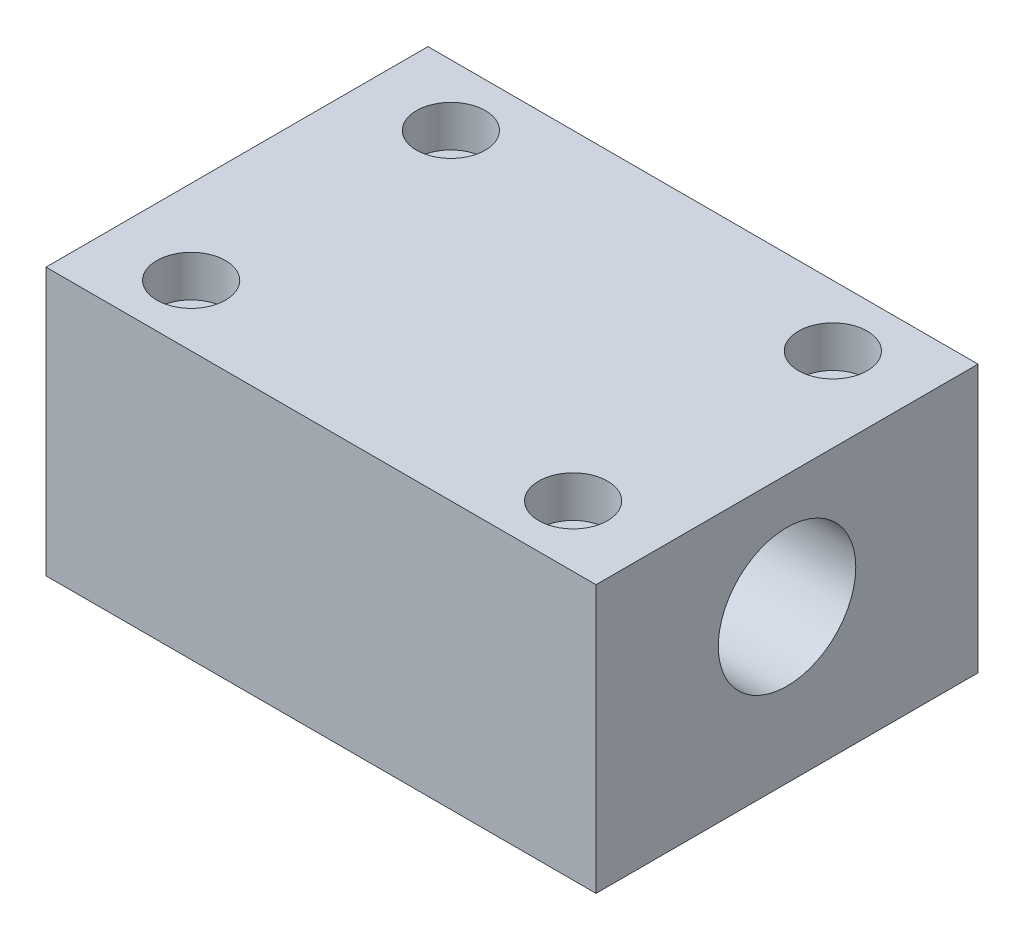
ISO-10303-21;
HEADER;
FILE_DESCRIPTION(('STEP AP214'),'2;1');
FILE_NAME('part.step','',(''),(''),'','','');
FILE_SCHEMA(('AUTOMOTIVE_DESIGN { 1 0 10303 214 1 1 1 1 }'));
ENDSEC;
DATA;
#1=APPLICATION_CONTEXT('core data for automotive mechanical design processes');
#2=APPLICATION_PROTOCOL_DEFINITION('international standard','automotive_design',2000,#1);
#3=PRODUCT_CONTEXT('',#1,'mechanical');
#4=PRODUCT('Part','Part','',(#3));
#5=PRODUCT_RELATED_PRODUCT_CATEGORY('part','',(#4));
#6=PRODUCT_DEFINITION_FORMATION('','',#4);
#7=PRODUCT_DEFINITION_CONTEXT('part definition',#1,'design');
#8=PRODUCT_DEFINITION('design','',#6,#7);
#9=PRODUCT_DEFINITION_SHAPE('','',#8);
#10=(LENGTH_UNIT() NAMED_UNIT(*) SI_UNIT(.MILLI.,.METRE.));
#11=(NAMED_UNIT(*) PLANE_ANGLE_UNIT() SI_UNIT($,.RADIAN.));
#12=(NAMED_UNIT(*) SI_UNIT($,.STERADIAN.) SOLID_ANGLE_UNIT());
#13=UNCERTAINTY_MEASURE_WITH_UNIT(LENGTH_MEASURE(1.E-05),#10,'distance_accuracy_value','');
#14=(GEOMETRIC_REPRESENTATION_CONTEXT(3) GLOBAL_UNCERTAINTY_ASSIGNED_CONTEXT((#13)) GLOBAL_UNIT_ASSIGNED_CONTEXT((#10,
#11,#12)) REPRESENTATION_CONTEXT('',''));
#15=CARTESIAN_POINT('',(0.,0.,0.));
#16=DIRECTION('',(0.,0.,1.));
#17=DIRECTION('',(1.,0.,0.));
#18=AXIS2_PLACEMENT_3D('',#15,#16,#17);
#19=CARTESIAN_POINT('',(11.,-20.,-17.));
#20=DIRECTION('',(0.,1.,0.));
#21=DIRECTION('',(0.,0.,1.));
#22=AXIS2_PLACEMENT_3D('',#19,#20,#21);
#23=CYLINDRICAL_SURFACE('',#22,2.75);
#24=CARTESIAN_POINT('',(11.,-20.,-17.));
#25=DIRECTION('',(0.,1.,0.));
#26=DIRECTION('',(0.,0.,1.));
#27=AXIS2_PLACEMENT_3D('',#24,#25,#26);
#28=CIRCLE('',#27,2.75);
#29=CARTESIAN_POINT('',(11.,-20.,-14.25));
#30=VERTEX_POINT('',#29);
#31=EDGE_CURVE('E142',#30,#30,#28,.T.);
#32=ORIENTED_EDGE('',*,*,#31,.F.);
#33=EDGE_LOOP('',(#32));
#34=FACE_BOUND('',#33,.T.);
#35=CARTESIAN_POINT('',(11.,9.6,-17.));
#36=DIRECTION('',(0.,1.,0.));
#37=DIRECTION('',(0.,0.,1.));
#38=AXIS2_PLACEMENT_3D('',#35,#36,#37);
#39=CIRCLE('',#38,2.75);
#40=CARTESIAN_POINT('',(11.,9.6,-14.25));
#41=VERTEX_POINT('',#40);
#42=EDGE_CURVE('E43',#41,#41,#39,.F.);
#43=ORIENTED_EDGE('',*,*,#42,.F.);
#44=EDGE_LOOP('',(#43));
#45=FACE_BOUND('',#44,.T.);
#46=ADVANCED_FACE('F39',(#34,#45),#23,.F.);
#47=CARTESIAN_POINT('',(61.,-20.,17.));
#48=DIRECTION('',(0.,1.,0.));
#49=DIRECTION('',(0.,0.,1.));
#50=AXIS2_PLACEMENT_3D('',#47,#48,#49);
#51=CYLINDRICAL_SURFACE('',#50,2.75);
#52=CARTESIAN_POINT('',(61.,-20.,17.));
#53=DIRECTION('',(0.,1.,0.));
#54=DIRECTION('',(0.,0.,1.));
#55=AXIS2_PLACEMENT_3D('',#52,#53,#54);
#56=CIRCLE('',#55,2.75);
#57=CARTESIAN_POINT('',(61.,-20.,19.75));
#58=VERTEX_POINT('',#57);
#59=EDGE_CURVE('E126',#58,#58,#56,.T.);
#60=ORIENTED_EDGE('',*,*,#59,.F.);
#61=EDGE_LOOP('',(#60));
#62=FACE_BOUND('',#61,.T.);
#63=CARTESIAN_POINT('',(61.,9.6,17.));
#64=DIRECTION('',(0.,1.,0.));
#65=DIRECTION('',(0.,0.,1.));
#66=AXIS2_PLACEMENT_3D('',#63,#64,#65);
#67=CIRCLE('',#66,2.75);
#68=CARTESIAN_POINT('',(61.,9.6,19.75));
#69=VERTEX_POINT('',#68);
#70=EDGE_CURVE('E121',#69,#69,#67,.F.);
#71=ORIENTED_EDGE('',*,*,#70,.F.);
#72=EDGE_LOOP('',(#71));
#73=FACE_BOUND('',#72,.T.);
#74=ADVANCED_FACE('F188',(#62,#73),#51,.F.);
#75=CARTESIAN_POINT('',(11.,-20.,17.));
#76=DIRECTION('',(0.,1.,0.));
#77=DIRECTION('',(0.,0.,1.));
#78=AXIS2_PLACEMENT_3D('',#75,#76,#77);
#79=CYLINDRICAL_SURFACE('',#78,2.75);
#80=CARTESIAN_POINT('',(11.,-20.,17.));
#81=DIRECTION('',(0.,1.,0.));
#82=DIRECTION('',(0.,0.,1.));
#83=AXIS2_PLACEMENT_3D('',#80,#81,#82);
#84=CIRCLE('',#83,2.75);
#85=CARTESIAN_POINT('',(11.,-20.,19.75));
#86=VERTEX_POINT('',#85);
#87=EDGE_CURVE('E130',#86,#86,#84,.T.);
#88=ORIENTED_EDGE('',*,*,#87,.F.);
#89=EDGE_LOOP('',(#88));
#90=FACE_BOUND('',#89,.T.);
#91=CARTESIAN_POINT('',(11.,9.6,17.));
#92=DIRECTION('',(0.,1.,0.));
#93=DIRECTION('',(0.,0.,1.));
#94=AXIS2_PLACEMENT_3D('',#91,#92,#93);
#95=CIRCLE('',#94,2.75);
#96=CARTESIAN_POINT('',(11.,9.6,19.75));
#97=VERTEX_POINT('',#96);
#98=EDGE_CURVE('E118',#97,#97,#95,.F.);
#99=ORIENTED_EDGE('',*,*,#98,.F.);
#100=EDGE_LOOP('',(#99));
#101=FACE_BOUND('',#100,.T.);
#102=ADVANCED_FACE('F195',(#90,#101),#79,.F.);
#103=CARTESIAN_POINT('',(61.,-20.,-17.));
#104=DIRECTION('',(0.,1.,0.));
#105=DIRECTION('',(0.,0.,1.));
#106=AXIS2_PLACEMENT_3D('',#103,#104,#105);
#107=CYLINDRICAL_SURFACE('',#106,2.75);
#108=CARTESIAN_POINT('',(61.,-20.,-17.));
#109=DIRECTION('',(0.,1.,0.));
#110=DIRECTION('',(0.,0.,1.));
#111=AXIS2_PLACEMENT_3D('',#108,#109,#110);
#112=CIRCLE('',#111,2.75);
#113=CARTESIAN_POINT('',(61.,-20.,-14.25));
#114=VERTEX_POINT('',#113);
#115=EDGE_CURVE('E135',#114,#114,#112,.T.);
#116=ORIENTED_EDGE('',*,*,#115,.F.);
#117=EDGE_LOOP('',(#116));
#118=FACE_BOUND('',#117,.T.);
#119=CARTESIAN_POINT('',(61.,9.6,-17.));
#120=DIRECTION('',(0.,1.,0.));
#121=DIRECTION('',(0.,0.,1.));
#122=AXIS2_PLACEMENT_3D('',#119,#120,#121);
#123=CIRCLE('',#122,2.75);
#124=CARTESIAN_POINT('',(61.,9.6,-14.25));
#125=VERTEX_POINT('',#124);
#126=EDGE_CURVE('E115',#125,#125,#123,.F.);
#127=ORIENTED_EDGE('',*,*,#126,.F.);
#128=EDGE_LOOP('',(#127));
#129=FACE_BOUND('',#128,.T.);
#130=ADVANCED_FACE('F294',(#118,#129),#107,.F.);
#131=CARTESIAN_POINT('',(72.,-20.,25.));
#132=DIRECTION('',(0.,0.,-1.));
#133=DIRECTION('',(-1.,0.,0.));
#134=AXIS2_PLACEMENT_3D('',#131,#132,#133);
#135=PLANE('',#134);
#136=DIRECTION('',(0.,-1.,0.));
#137=VECTOR('',#136,1.);
#138=CARTESIAN_POINT('',(0.,-20.,25.));
#139=LINE('',#138,#137);
#140=CARTESIAN_POINT('',(0.,15.,25.));
#141=VERTEX_POINT('',#140);
#142=CARTESIAN_POINT('',(0.,-20.,25.));
#143=VERTEX_POINT('',#142);
#144=EDGE_CURVE('E106',#141,#143,#139,.T.);
#145=ORIENTED_EDGE('',*,*,#144,.T.);
#146=DIRECTION('',(-1.,0.,0.));
#147=VECTOR('',#146,1.);
#148=CARTESIAN_POINT('',(72.,-20.,25.));
#149=LINE('',#148,#147);
#150=CARTESIAN_POINT('',(72.,-20.,25.));
#151=VERTEX_POINT('',#150);
#152=EDGE_CURVE('E11',#151,#143,#149,.T.);
#153=ORIENTED_EDGE('',*,*,#152,.F.);
#154=DIRECTION('',(0.,-1.,0.));
#155=VECTOR('',#154,1.);
#156=CARTESIAN_POINT('',(72.,-20.,25.));
#157=LINE('',#156,#155);
#158=CARTESIAN_POINT('',(72.,15.,25.));
#159=VERTEX_POINT('',#158);
#160=EDGE_CURVE('E93',#159,#151,#157,.T.);
#161=ORIENTED_EDGE('',*,*,#160,.F.);
#162=DIRECTION('',(-1.,0.,0.));
#163=VECTOR('',#162,1.);
#164=CARTESIAN_POINT('',(72.,15.,25.));
#165=LINE('',#164,#163);
#166=EDGE_CURVE('E102',#159,#141,#165,.T.);
#167=ORIENTED_EDGE('',*,*,#166,.T.);
#168=EDGE_LOOP('',(#145,#153,#161,#167));
#169=FACE_BOUND('',#168,.T.);
#170=ADVANCED_FACE('F41',(#169),#135,.F.);
#171=CARTESIAN_POINT('',(72.,-20.,25.));
#172=DIRECTION('',(0.,1.,0.));
#173=DIRECTION('',(0.,0.,1.));
#174=AXIS2_PLACEMENT_3D('',#171,#172,#173);
#175=PLANE('',#174);
#176=ORIENTED_EDGE('',*,*,#115,.T.);
#177=EDGE_LOOP('',(#176));
#178=FACE_BOUND('',#177,.T.);
#179=ORIENTED_EDGE('',*,*,#87,.T.);
#180=EDGE_LOOP('',(#179));
#181=FACE_BOUND('',#180,.T.);
#182=ORIENTED_EDGE('',*,*,#59,.T.);
#183=EDGE_LOOP('',(#182));
#184=FACE_BOUND('',#183,.T.);
#185=ORIENTED_EDGE('',*,*,#31,.T.);
#186=EDGE_LOOP('',(#185));
#187=FACE_BOUND('',#186,.T.);
#188=DIRECTION('',(0.,0.,-1.));
#189=VECTOR('',#188,1.);
#190=CARTESIAN_POINT('',(0.,-20.,25.));
#191=LINE('',#190,#189);
#192=CARTESIAN_POINT('',(0.,-20.,-25.));
#193=VERTEX_POINT('',#192);
#194=EDGE_CURVE('E97',#143,#193,#191,.T.);
#195=ORIENTED_EDGE('',*,*,#194,.T.);
#196=DIRECTION('',(-1.,0.,0.));
#197=VECTOR('',#196,1.);
#198=CARTESIAN_POINT('',(72.,-20.,-25.));
#199=LINE('',#198,#197);
#200=CARTESIAN_POINT('',(72.,-20.,-25.));
#201=VERTEX_POINT('',#200);
#202=EDGE_CURVE('E49',#201,#193,#199,.T.);
#203=ORIENTED_EDGE('',*,*,#202,.F.);
#204=DIRECTION('',(0.,0.,-1.));
#205=VECTOR('',#204,1.);
#206=CARTESIAN_POINT('',(72.,-20.,25.));
#207=LINE('',#206,#205);
#208=EDGE_CURVE('E88',#151,#201,#207,.T.);
#209=ORIENTED_EDGE('',*,*,#208,.F.);
#210=ORIENTED_EDGE('',*,*,#152,.T.);
#211=EDGE_LOOP('',(#195,#203,#209,#210));
#212=FACE_BOUND('',#211,.T.);
#213=ADVANCED_FACE('F96',(#178,#181,#184,#187,#212),#175,.F.);
#214=CARTESIAN_POINT('',(72.,-20.,-25.));
#215=DIRECTION('',(0.,0.,1.));
#216=DIRECTION('',(1.,0.,0.));
#217=AXIS2_PLACEMENT_3D('',#214,#215,#216);
#218=PLANE('',#217);
#219=DIRECTION('',(0.,1.,0.));
#220=VECTOR('',#219,1.);
#221=CARTESIAN_POINT('',(0.,-20.,-25.));
#222=LINE('',#221,#220);
#223=CARTESIAN_POINT('',(0.,15.,-25.));
#224=VERTEX_POINT('',#223);
#225=EDGE_CURVE('E75',#193,#224,#222,.T.);
#226=ORIENTED_EDGE('',*,*,#225,.T.);
#227=DIRECTION('',(-1.,0.,0.));
#228=VECTOR('',#227,1.);
#229=CARTESIAN_POINT('',(72.,15.,-25.));
#230=LINE('',#229,#228);
#231=CARTESIAN_POINT('',(72.,15.,-25.));
#232=VERTEX_POINT('',#231);
#233=EDGE_CURVE('E98',#232,#224,#230,.T.);
#234=ORIENTED_EDGE('',*,*,#233,.F.);
#235=DIRECTION('',(0.,1.,0.));
#236=VECTOR('',#235,1.);
#237=CARTESIAN_POINT('',(72.,-20.,-25.));
#238=LINE('',#237,#236);
#239=EDGE_CURVE('E91',#201,#232,#238,.T.);
#240=ORIENTED_EDGE('',*,*,#239,.F.);
#241=ORIENTED_EDGE('',*,*,#202,.T.);
#242=EDGE_LOOP('',(#226,#234,#240,#241));
#243=FACE_BOUND('',#242,.T.);
#244=ADVANCED_FACE('F100',(#243),#218,.F.);
#245=CARTESIAN_POINT('',(72.,15.,25.));
#246=DIRECTION('',(0.,-1.,0.));
#247=DIRECTION('',(0.,0.,-1.));
#248=AXIS2_PLACEMENT_3D('',#245,#246,#247);
#249=PLANE('',#248);
#250=CARTESIAN_POINT('',(61.,15.,-17.));
#251=DIRECTION('',(0.,1.,0.));
#252=DIRECTION('',(0.,0.,1.));
#253=AXIS2_PLACEMENT_3D('',#250,#251,#252);
#254=CIRCLE('',#253,4.5);
#255=CARTESIAN_POINT('',(61.,15.,-12.5));
#256=VERTEX_POINT('',#255);
#257=EDGE_CURVE('E435',#256,#256,#254,.T.);
#258=ORIENTED_EDGE('',*,*,#257,.F.);
#259=EDGE_LOOP('',(#258));
#260=FACE_BOUND('',#259,.T.);
#261=CARTESIAN_POINT('',(11.,15.,17.));
#262=DIRECTION('',(0.,1.,0.));
#263=DIRECTION('',(0.,0.,1.));
#264=AXIS2_PLACEMENT_3D('',#261,#262,#263);
#265=CIRCLE('',#264,4.5);
#266=CARTESIAN_POINT('',(11.,15.,21.5));
#267=VERTEX_POINT('',#266);
#268=EDGE_CURVE('E442',#267,#267,#265,.T.);
#269=ORIENTED_EDGE('',*,*,#268,.F.);
#270=EDGE_LOOP('',(#269));
#271=FACE_BOUND('',#270,.T.);
#272=CARTESIAN_POINT('',(61.,15.,17.));
#273=DIRECTION('',(0.,1.,0.));
#274=DIRECTION('',(0.,0.,1.));
#275=AXIS2_PLACEMENT_3D('',#272,#273,#274);
#276=CIRCLE('',#275,4.5);
#277=CARTESIAN_POINT('',(61.,15.,21.5));
#278=VERTEX_POINT('',#277);
#279=EDGE_CURVE('E452',#278,#278,#276,.T.);
#280=ORIENTED_EDGE('',*,*,#279,.F.);
#281=EDGE_LOOP('',(#280));
#282=FACE_BOUND('',#281,.T.);
#283=CARTESIAN_POINT('',(11.,15.,-17.));
#284=DIRECTION('',(0.,1.,0.));
#285=DIRECTION('',(0.,0.,1.));
#286=AXIS2_PLACEMENT_3D('',#283,#284,#285);
#287=CIRCLE('',#286,4.5);
#288=CARTESIAN_POINT('',(11.,15.,-12.5));
#289=VERTEX_POINT('',#288);
#290=EDGE_CURVE('E139',#289,#289,#287,.T.);
#291=ORIENTED_EDGE('',*,*,#290,.F.);
#292=EDGE_LOOP('',(#291));
#293=FACE_BOUND('',#292,.T.);
#294=DIRECTION('',(0.,0.,1.));
#295=VECTOR('',#294,1.);
#296=CARTESIAN_POINT('',(0.,15.,25.));
#297=LINE('',#296,#295);
#298=EDGE_CURVE('E81',#224,#141,#297,.T.);
#299=ORIENTED_EDGE('',*,*,#298,.T.);
#300=ORIENTED_EDGE('',*,*,#166,.F.);
#301=DIRECTION('',(0.,0.,1.));
#302=VECTOR('',#301,1.);
#303=CARTESIAN_POINT('',(72.,15.,25.));
#304=LINE('',#303,#302);
#305=EDGE_CURVE('E58',#232,#159,#304,.T.);
#306=ORIENTED_EDGE('',*,*,#305,.F.);
#307=ORIENTED_EDGE('',*,*,#233,.T.);
#308=EDGE_LOOP('',(#299,#300,#306,#307));
#309=FACE_BOUND('',#308,.T.);
#310=ADVANCED_FACE('F247',(#260,#271,#282,#293,#309),#249,.F.);
#311=CARTESIAN_POINT('',(72.,0.,0.));
#312=DIRECTION('',(-1.,0.,0.));
#313=DIRECTION('',(0.,0.,1.));
#314=AXIS2_PLACEMENT_3D('',#311,#312,#313);
#315=PLANE('',#314);
#316=CARTESIAN_POINT('',(72.,0.,0.));
#317=DIRECTION('',(1.,0.,0.));
#318=DIRECTION('',(0.,0.,-1.));
#319=AXIS2_PLACEMENT_3D('',#316,#317,#318);
#320=CIRCLE('',#319,9.);
#321=CARTESIAN_POINT('',(72.,0.,-9.));
#322=VERTEX_POINT('',#321);
#323=EDGE_CURVE('E147',#322,#322,#320,.T.);
#324=ORIENTED_EDGE('',*,*,#323,.F.);
#325=EDGE_LOOP('',(#324));
#326=FACE_BOUND('',#325,.T.);
#327=ORIENTED_EDGE('',*,*,#160,.T.);
#328=ORIENTED_EDGE('',*,*,#208,.T.);
#329=ORIENTED_EDGE('',*,*,#239,.T.);
#330=ORIENTED_EDGE('',*,*,#305,.T.);
#331=EDGE_LOOP('',(#327,#328,#329,#330));
#332=FACE_BOUND('',#331,.T.);
#333=ADVANCED_FACE('F89',(#326,#332),#315,.F.);
#334=CARTESIAN_POINT('',(0.,0.,0.));
#335=DIRECTION('',(-1.,0.,0.));
#336=DIRECTION('',(0.,0.,1.));
#337=AXIS2_PLACEMENT_3D('',#334,#335,#336);
#338=PLANE('',#337);
#339=CARTESIAN_POINT('',(0.,0.,0.));
#340=DIRECTION('',(1.,0.,0.));
#341=DIRECTION('',(0.,0.,-1.));
#342=AXIS2_PLACEMENT_3D('',#339,#340,#341);
#343=CIRCLE('',#342,4.5);
#344=CARTESIAN_POINT('',(0.,0.,-4.5));
#345=VERTEX_POINT('',#344);
#346=EDGE_CURVE('E109',#345,#345,#343,.T.);
#347=ORIENTED_EDGE('',*,*,#346,.T.);
#348=EDGE_LOOP('',(#347));
#349=FACE_BOUND('',#348,.T.);
#350=ORIENTED_EDGE('',*,*,#144,.F.);
#351=ORIENTED_EDGE('',*,*,#298,.F.);
#352=ORIENTED_EDGE('',*,*,#225,.F.);
#353=ORIENTED_EDGE('',*,*,#194,.F.);
#354=EDGE_LOOP('',(#350,#351,#352,#353));
#355=FACE_BOUND('',#354,.T.);
#356=ADVANCED_FACE('F170',(#349,#355),#338,.T.);
#357=CARTESIAN_POINT('',(3.,0.,0.));
#358=DIRECTION('',(-1.,0.,0.));
#359=DIRECTION('',(0.,0.,1.));
#360=AXIS2_PLACEMENT_3D('',#357,#358,#359);
#361=CYLINDRICAL_SURFACE('',#360,4.5);
#362=CARTESIAN_POINT('',(3.,0.,0.));
#363=DIRECTION('',(1.,0.,0.));
#364=DIRECTION('',(0.,0.,-1.));
#365=AXIS2_PLACEMENT_3D('',#362,#363,#364);
#366=CIRCLE('',#365,4.5);
#367=CARTESIAN_POINT('',(3.,0.,-4.5));
#368=VERTEX_POINT('',#367);
#369=EDGE_CURVE('E164',#368,#368,#366,.T.);
#370=ORIENTED_EDGE('',*,*,#369,.T.);
#371=EDGE_LOOP('',(#370));
#372=FACE_BOUND('',#371,.T.);
#373=ORIENTED_EDGE('',*,*,#346,.F.);
#374=EDGE_LOOP('',(#373));
#375=FACE_BOUND('',#374,.T.);
#376=ADVANCED_FACE('F173',(#372,#375),#361,.F.);
#377=CARTESIAN_POINT('',(15.,0.,0.));
#378=DIRECTION('',(-1.,0.,0.));
#379=DIRECTION('',(0.,0.,1.));
#380=AXIS2_PLACEMENT_3D('',#377,#378,#379);
#381=CYLINDRICAL_SURFACE('',#380,6.);
#382=CARTESIAN_POINT('',(15.,0.,0.));
#383=DIRECTION('',(1.,0.,0.));
#384=DIRECTION('',(0.,0.,-1.));
#385=AXIS2_PLACEMENT_3D('',#382,#383,#384);
#386=CIRCLE('',#385,6.);
#387=CARTESIAN_POINT('',(15.,0.,-6.));
#388=VERTEX_POINT('',#387);
#389=EDGE_CURVE('E158',#388,#388,#386,.T.);
#390=ORIENTED_EDGE('',*,*,#389,.T.);
#391=EDGE_LOOP('',(#390));
#392=FACE_BOUND('',#391,.T.);
#393=CARTESIAN_POINT('',(3.,0.,0.));
#394=DIRECTION('',(1.,0.,0.));
#395=DIRECTION('',(0.,0.,-1.));
#396=AXIS2_PLACEMENT_3D('',#393,#394,#395);
#397=CIRCLE('',#396,6.);
#398=CARTESIAN_POINT('',(3.,0.,-6.));
#399=VERTEX_POINT('',#398);
#400=EDGE_CURVE('E161',#399,#399,#397,.T.);
#401=ORIENTED_EDGE('',*,*,#400,.F.);
#402=EDGE_LOOP('',(#401));
#403=FACE_BOUND('',#402,.T.);
#404=ADVANCED_FACE('F175',(#392,#403),#381,.F.);
#405=CARTESIAN_POINT('',(3.,0.,0.));
#406=DIRECTION('',(1.,0.,0.));
#407=DIRECTION('',(0.,0.,-1.));
#408=AXIS2_PLACEMENT_3D('',#405,#406,#407);
#409=PLANE('',#408);
#410=ORIENTED_EDGE('',*,*,#369,.F.);
#411=EDGE_LOOP('',(#410));
#412=FACE_BOUND('',#411,.T.);
#413=ORIENTED_EDGE('',*,*,#400,.T.);
#414=EDGE_LOOP('',(#413));
#415=FACE_BOUND('',#414,.T.);
#416=ADVANCED_FACE('F182',(#412,#415),#409,.T.);
#417=CARTESIAN_POINT('',(55.,0.,0.));
#418=DIRECTION('',(-1.,0.,0.));
#419=DIRECTION('',(0.,0.,1.));
#420=AXIS2_PLACEMENT_3D('',#417,#418,#419);
#421=CYLINDRICAL_SURFACE('',#420,6.5);
#422=CARTESIAN_POINT('',(55.,0.,0.));
#423=DIRECTION('',(1.,0.,0.));
#424=DIRECTION('',(0.,0.,-1.));
#425=AXIS2_PLACEMENT_3D('',#422,#423,#424);
#426=CIRCLE('',#425,6.5);
#427=CARTESIAN_POINT('',(55.,0.,-6.5));
#428=VERTEX_POINT('',#427);
#429=EDGE_CURVE('E150',#428,#428,#426,.T.);
#430=ORIENTED_EDGE('',*,*,#429,.T.);
#431=EDGE_LOOP('',(#430));
#432=FACE_BOUND('',#431,.T.);
#433=CARTESIAN_POINT('',(15.,0.,0.));
#434=DIRECTION('',(1.,0.,0.));
#435=DIRECTION('',(0.,0.,-1.));
#436=AXIS2_PLACEMENT_3D('',#433,#434,#435);
#437=CIRCLE('',#436,6.5);
#438=CARTESIAN_POINT('',(15.,0.,-6.5));
#439=VERTEX_POINT('',#438);
#440=EDGE_CURVE('E155',#439,#439,#437,.T.);
#441=ORIENTED_EDGE('',*,*,#440,.F.);
#442=EDGE_LOOP('',(#441));
#443=FACE_BOUND('',#442,.T.);
#444=ADVANCED_FACE('F215',(#432,#443),#421,.F.);
#445=CARTESIAN_POINT('',(15.,0.,0.));
#446=DIRECTION('',(1.,0.,0.));
#447=DIRECTION('',(0.,0.,-1.));
#448=AXIS2_PLACEMENT_3D('',#445,#446,#447);
#449=PLANE('',#448);
#450=ORIENTED_EDGE('',*,*,#389,.F.);
#451=EDGE_LOOP('',(#450));
#452=FACE_BOUND('',#451,.T.);
#453=ORIENTED_EDGE('',*,*,#440,.T.);
#454=EDGE_LOOP('',(#453));
#455=FACE_BOUND('',#454,.T.);
#456=ADVANCED_FACE('F211',(#452,#455),#449,.T.);
#457=CARTESIAN_POINT('',(72.,0.,0.));
#458=DIRECTION('',(-1.,0.,0.));
#459=DIRECTION('',(0.,0.,1.));
#460=AXIS2_PLACEMENT_3D('',#457,#458,#459);
#461=CYLINDRICAL_SURFACE('',#460,9.);
#462=ORIENTED_EDGE('',*,*,#323,.T.);
#463=EDGE_LOOP('',(#462));
#464=FACE_BOUND('',#463,.T.);
#465=CARTESIAN_POINT('',(55.,0.,0.));
#466=DIRECTION('',(1.,0.,0.));
#467=DIRECTION('',(0.,0.,-1.));
#468=AXIS2_PLACEMENT_3D('',#465,#466,#467);
#469=CIRCLE('',#468,9.);
#470=CARTESIAN_POINT('',(55.,0.,-9.));
#471=VERTEX_POINT('',#470);
#472=EDGE_CURVE('E146',#471,#471,#469,.T.);
#473=ORIENTED_EDGE('',*,*,#472,.F.);
#474=EDGE_LOOP('',(#473));
#475=FACE_BOUND('',#474,.T.);
#476=ADVANCED_FACE('F207',(#464,#475),#461,.F.);
#477=CARTESIAN_POINT('',(55.,0.,0.));
#478=DIRECTION('',(1.,0.,0.));
#479=DIRECTION('',(0.,0.,-1.));
#480=AXIS2_PLACEMENT_3D('',#477,#478,#479);
#481=PLANE('',#480);
#482=ORIENTED_EDGE('',*,*,#429,.F.);
#483=EDGE_LOOP('',(#482));
#484=FACE_BOUND('',#483,.T.);
#485=ORIENTED_EDGE('',*,*,#472,.T.);
#486=EDGE_LOOP('',(#485));
#487=FACE_BOUND('',#486,.T.);
#488=ADVANCED_FACE('F203',(#484,#487),#481,.T.);
#489=CARTESIAN_POINT('',(61.,9.6,-17.));
#490=DIRECTION('',(0.,1.,0.));
#491=DIRECTION('',(0.,0.,1.));
#492=AXIS2_PLACEMENT_3D('',#489,#490,#491);
#493=PLANE('',#492);
#494=CARTESIAN_POINT('',(61.,9.6,-17.));
#495=DIRECTION('',(0.,1.,0.));
#496=DIRECTION('',(0.,0.,1.));
#497=AXIS2_PLACEMENT_3D('',#494,#495,#496);
#498=CIRCLE('',#497,4.5);
#499=CARTESIAN_POINT('',(61.,9.6,-12.5));
#500=VERTEX_POINT('',#499);
#501=EDGE_CURVE('E437',#500,#500,#498,.T.);
#502=ORIENTED_EDGE('',*,*,#501,.T.);
#503=EDGE_LOOP('',(#502));
#504=FACE_BOUND('',#503,.T.);
#505=ORIENTED_EDGE('',*,*,#126,.T.);
#506=EDGE_LOOP('',(#505));
#507=FACE_BOUND('',#506,.T.);
#508=ADVANCED_FACE('F206',(#504,#507),#493,.T.);
#509=CARTESIAN_POINT('',(61.,9.6,-17.));
#510=DIRECTION('',(0.,1.,0.));
#511=DIRECTION('',(0.,0.,1.));
#512=AXIS2_PLACEMENT_3D('',#509,#510,#511);
#513=CYLINDRICAL_SURFACE('',#512,4.5);
#514=CARTESIAN_POINT('',(61.,9.6,-12.5));
#515=CARTESIAN_POINT('',(61.,9.65625,-12.5));
#516=CARTESIAN_POINT('',(61.,9.7125,-12.5));
#517=CARTESIAN_POINT('',(61.,9.825,-12.5));
#518=CARTESIAN_POINT('',(61.,9.88125,-12.5));
#519=CARTESIAN_POINT('',(61.,9.99375,-12.5));
#520=CARTESIAN_POINT('',(61.,10.05,-12.5));
#521=CARTESIAN_POINT('',(61.,10.1625,-12.5));
#522=CARTESIAN_POINT('',(61.,10.21875,-12.5));
#523=CARTESIAN_POINT('',(61.,10.33125,-12.5));
#524=CARTESIAN_POINT('',(61.,10.3875,-12.5));
#525=CARTESIAN_POINT('',(61.,10.5,-12.5));
#526=CARTESIAN_POINT('',(61.,10.55625,-12.5));
#527=CARTESIAN_POINT('',(61.,10.66875,-12.5));
#528=CARTESIAN_POINT('',(61.,10.725,-12.5));
#529=CARTESIAN_POINT('',(61.,10.8375,-12.5));
#530=CARTESIAN_POINT('',(61.,10.89375,-12.5));
#531=CARTESIAN_POINT('',(61.,11.00625,-12.5));
#532=CARTESIAN_POINT('',(61.,11.0625,-12.5));
#533=CARTESIAN_POINT('',(61.,11.175,-12.5));
#534=CARTESIAN_POINT('',(61.,11.23125,-12.5));
#535=CARTESIAN_POINT('',(61.,11.34375,-12.5));
#536=CARTESIAN_POINT('',(61.,11.4,-12.5));
#537=CARTESIAN_POINT('',(61.,11.5125,-12.5));
#538=CARTESIAN_POINT('',(61.,11.56875,-12.5));
#539=CARTESIAN_POINT('',(61.,11.68125,-12.5));
#540=CARTESIAN_POINT('',(61.,11.7375,-12.5));
#541=CARTESIAN_POINT('',(61.,11.85,-12.5));
#542=CARTESIAN_POINT('',(61.,11.90625,-12.5));
#543=CARTESIAN_POINT('',(61.,12.01875,-12.5));
#544=CARTESIAN_POINT('',(61.,12.075,-12.5));
#545=CARTESIAN_POINT('',(61.,12.1875,-12.5));
#546=CARTESIAN_POINT('',(61.,12.24375,-12.5));
#547=CARTESIAN_POINT('',(61.,12.35625,-12.5));
#548=CARTESIAN_POINT('',(61.,12.4125,-12.5));
#549=CARTESIAN_POINT('',(61.,12.525,-12.5));
#550=CARTESIAN_POINT('',(61.,12.58125,-12.5));
#551=CARTESIAN_POINT('',(61.,12.69375,-12.5));
#552=CARTESIAN_POINT('',(61.,12.75,-12.5));
#553=CARTESIAN_POINT('',(61.,12.8625,-12.5));
#554=CARTESIAN_POINT('',(61.,12.91875,-12.5));
#555=CARTESIAN_POINT('',(61.,13.03125,-12.5));
#556=CARTESIAN_POINT('',(61.,13.0875,-12.5));
#557=CARTESIAN_POINT('',(61.,13.2,-12.5));
#558=CARTESIAN_POINT('',(61.,13.25625,-12.5));
#559=CARTESIAN_POINT('',(61.,13.36875,-12.5));
#560=CARTESIAN_POINT('',(61.,13.425,-12.5));
#561=CARTESIAN_POINT('',(61.,13.5375,-12.5));
#562=CARTESIAN_POINT('',(61.,13.59375,-12.5));
#563=CARTESIAN_POINT('',(61.,13.70625,-12.5));
#564=CARTESIAN_POINT('',(61.,13.7625,-12.5));
#565=CARTESIAN_POINT('',(61.,13.875,-12.5));
#566=CARTESIAN_POINT('',(61.,13.93125,-12.5));
#567=CARTESIAN_POINT('',(61.,14.04375,-12.5));
#568=CARTESIAN_POINT('',(61.,14.1,-12.5));
#569=CARTESIAN_POINT('',(61.,14.2125,-12.5));
#570=CARTESIAN_POINT('',(61.,14.26875,-12.5));
#571=CARTESIAN_POINT('',(61.,14.38125,-12.5));
#572=CARTESIAN_POINT('',(61.,14.4375,-12.5));
#573=CARTESIAN_POINT('',(61.,14.55,-12.5));
#574=CARTESIAN_POINT('',(61.,14.60625,-12.5));
#575=CARTESIAN_POINT('',(61.,14.71875,-12.5));
#576=CARTESIAN_POINT('',(61.,14.775,-12.5));
#577=CARTESIAN_POINT('',(61.,14.8875,-12.5));
#578=CARTESIAN_POINT('',(61.,14.94375,-12.5));
#579=CARTESIAN_POINT('',(61.,15.,-12.5));
#580=B_SPLINE_CURVE_WITH_KNOTS('',3,(#514,#515,#516,#517,#518,#519,#520,#521,#522,#523,#524,
#525,#526,#527,#528,#529,#530,#531,#532,#533,#534,#535,#536,#537,#538,#539,#540,#541,#542,#543,
#544,#545,#546,#547,#548,#549,#550,#551,#552,#553,#554,#555,#556,#557,#558,#559,#560,#561,#562,
#563,#564,#565,#566,#567,#568,#569,#570,#571,#572,#573,#574,#575,#576,#577,#578,#579),
.UNSPECIFIED.,.F.,.F.,(4,2,2,2,2,2,2,2,2,2,2,2,2,2,2,2,2,2,2,2,2,2,2,2,2,2,2,2,2,2,2,2,4),(0.,
0.168749999999999,0.337499999999999,0.50625,0.674999999999998,0.843749999999999,1.0125,1.18125,
1.35,1.51875,1.6875,1.85625,2.025,2.19375,2.3625,2.53125,2.7,2.86875,3.0375,3.20625,3.375,
3.54375,3.7125,3.88125,4.05,4.21875,4.3875,4.55625,4.725,4.89375,5.0625,5.23125,5.4),.UNSPECIFIED.);
#581=EDGE_CURVE('BSEAM301',#500,#256,#580,.T.);
#582=ORIENTED_EDGE('',*,*,#501,.F.);
#583=ORIENTED_EDGE('',*,*,#257,.T.);
#584=ORIENTED_EDGE('',*,*,#581,.T.);
#585=ORIENTED_EDGE('',*,*,#581,.F.);
#586=EDGE_LOOP('',(#582,#584,#583,#585));
#587=FACE_BOUND('',#586,.T.);
#588=ADVANCED_FACE('F301',(#587),#513,.F.);
#589=CARTESIAN_POINT('',(11.,9.6,17.));
#590=DIRECTION('',(0.,1.,0.));
#591=DIRECTION('',(0.,0.,1.));
#592=AXIS2_PLACEMENT_3D('',#589,#590,#591);
#593=PLANE('',#592);
#594=CARTESIAN_POINT('',(11.,9.6,17.));
#595=DIRECTION('',(0.,1.,0.));
#596=DIRECTION('',(0.,0.,1.));
#597=AXIS2_PLACEMENT_3D('',#594,#595,#596);
#598=CIRCLE('',#597,4.5);
#599=CARTESIAN_POINT('',(11.,9.6,21.5));
#600=VERTEX_POINT('',#599);
#601=EDGE_CURVE('E450',#600,#600,#598,.T.);
#602=ORIENTED_EDGE('',*,*,#601,.T.);
#603=EDGE_LOOP('',(#602));
#604=FACE_BOUND('',#603,.T.);
#605=ORIENTED_EDGE('',*,*,#98,.T.);
#606=EDGE_LOOP('',(#605));
#607=FACE_BOUND('',#606,.T.);
#608=ADVANCED_FACE('F311',(#604,#607),#593,.T.);
#609=CARTESIAN_POINT('',(11.,9.6,17.));
#610=DIRECTION('',(0.,1.,0.));
#611=DIRECTION('',(0.,0.,1.));
#612=AXIS2_PLACEMENT_3D('',#609,#610,#611);
#613=CYLINDRICAL_SURFACE('',#612,4.5);
#614=CARTESIAN_POINT('',(11.,9.6,21.5));
#615=CARTESIAN_POINT('',(11.,9.65625,21.5));
#616=CARTESIAN_POINT('',(11.,9.7125,21.5));
#617=CARTESIAN_POINT('',(11.,9.825,21.5));
#618=CARTESIAN_POINT('',(11.,9.88125,21.5));
#619=CARTESIAN_POINT('',(11.,9.99375,21.5));
#620=CARTESIAN_POINT('',(11.,10.05,21.5));
#621=CARTESIAN_POINT('',(11.,10.1625,21.5));
#622=CARTESIAN_POINT('',(11.,10.21875,21.5));
#623=CARTESIAN_POINT('',(11.,10.33125,21.5));
#624=CARTESIAN_POINT('',(11.,10.3875,21.5));
#625=CARTESIAN_POINT('',(11.,10.5,21.5));
#626=CARTESIAN_POINT('',(11.,10.55625,21.5));
#627=CARTESIAN_POINT('',(11.,10.66875,21.5));
#628=CARTESIAN_POINT('',(11.,10.725,21.5));
#629=CARTESIAN_POINT('',(11.,10.8375,21.5));
#630=CARTESIAN_POINT('',(11.,10.89375,21.5));
#631=CARTESIAN_POINT('',(11.,11.00625,21.5));
#632=CARTESIAN_POINT('',(11.,11.0625,21.5));
#633=CARTESIAN_POINT('',(11.,11.175,21.5));
#634=CARTESIAN_POINT('',(11.,11.23125,21.5));
#635=CARTESIAN_POINT('',(11.,11.34375,21.5));
#636=CARTESIAN_POINT('',(11.,11.4,21.5));
#637=CARTESIAN_POINT('',(11.,11.5125,21.5));
#638=CARTESIAN_POINT('',(11.,11.56875,21.5));
#639=CARTESIAN_POINT('',(11.,11.68125,21.5));
#640=CARTESIAN_POINT('',(11.,11.7375,21.5));
#641=CARTESIAN_POINT('',(11.,11.85,21.5));
#642=CARTESIAN_POINT('',(11.,11.90625,21.5));
#643=CARTESIAN_POINT('',(11.,12.01875,21.5));
#644=CARTESIAN_POINT('',(11.,12.075,21.5));
#645=CARTESIAN_POINT('',(11.,12.1875,21.5));
#646=CARTESIAN_POINT('',(11.,12.24375,21.5));
#647=CARTESIAN_POINT('',(11.,12.35625,21.5));
#648=CARTESIAN_POINT('',(11.,12.4125,21.5));
#649=CARTESIAN_POINT('',(11.,12.525,21.5));
#650=CARTESIAN_POINT('',(11.,12.58125,21.5));
#651=CARTESIAN_POINT('',(11.,12.69375,21.5));
#652=CARTESIAN_POINT('',(11.,12.75,21.5));
#653=CARTESIAN_POINT('',(11.,12.8625,21.5));
#654=CARTESIAN_POINT('',(11.,12.91875,21.5));
#655=CARTESIAN_POINT('',(11.,13.03125,21.5));
#656=CARTESIAN_POINT('',(11.,13.0875,21.5));
#657=CARTESIAN_POINT('',(11.,13.2,21.5));
#658=CARTESIAN_POINT('',(11.,13.25625,21.5));
#659=CARTESIAN_POINT('',(11.,13.36875,21.5));
#660=CARTESIAN_POINT('',(11.,13.425,21.5));
#661=CARTESIAN_POINT('',(11.,13.5375,21.5));
#662=CARTESIAN_POINT('',(11.,13.59375,21.5));
#663=CARTESIAN_POINT('',(11.,13.70625,21.5));
#664=CARTESIAN_POINT('',(11.,13.7625,21.5));
#665=CARTESIAN_POINT('',(11.,13.875,21.5));
#666=CARTESIAN_POINT('',(11.,13.93125,21.5));
#667=CARTESIAN_POINT('',(11.,14.04375,21.5));
#668=CARTESIAN_POINT('',(11.,14.1,21.5));
#669=CARTESIAN_POINT('',(11.,14.2125,21.5));
#670=CARTESIAN_POINT('',(11.,14.26875,21.5));
#671=CARTESIAN_POINT('',(11.,14.38125,21.5));
#672=CARTESIAN_POINT('',(11.,14.4375,21.5));
#673=CARTESIAN_POINT('',(11.,14.55,21.5));
#674=CARTESIAN_POINT('',(11.,14.60625,21.5));
#675=CARTESIAN_POINT('',(11.,14.71875,21.5));
#676=CARTESIAN_POINT('',(11.,14.775,21.5));
#677=CARTESIAN_POINT('',(11.,14.8875,21.5));
#678=CARTESIAN_POINT('',(11.,14.94375,21.5));
#679=CARTESIAN_POINT('',(11.,15.,21.5));
#680=B_SPLINE_CURVE_WITH_KNOTS('',3,(#614,#615,#616,#617,#618,#619,#620,#621,#622,#623,#624,
#625,#626,#627,#628,#629,#630,#631,#632,#633,#634,#635,#636,#637,#638,#639,#640,#641,#642,#643,
#644,#645,#646,#647,#648,#649,#650,#651,#652,#653,#654,#655,#656,#657,#658,#659,#660,#661,#662,
#663,#664,#665,#666,#667,#668,#669,#670,#671,#672,#673,#674,#675,#676,#677,#678,#679),
.UNSPECIFIED.,.F.,.F.,(4,2,2,2,2,2,2,2,2,2,2,2,2,2,2,2,2,2,2,2,2,2,2,2,2,2,2,2,2,2,2,2,4),(0.,
0.168749999999999,0.337499999999999,0.50625,0.674999999999998,0.843749999999999,1.0125,1.18125,
1.35,1.51875,1.6875,1.85625,2.025,2.19375,2.3625,2.53125,2.7,2.86875,3.0375,3.20625,3.375,
3.54375,3.7125,3.88125,4.05,4.21875,4.3875,4.55625,4.725,4.89375,5.0625,5.23125,5.4),.UNSPECIFIED.);
#681=EDGE_CURVE('BSEAM320',#600,#267,#680,.T.);
#682=ORIENTED_EDGE('',*,*,#601,.F.);
#683=ORIENTED_EDGE('',*,*,#268,.T.);
#684=ORIENTED_EDGE('',*,*,#681,.T.);
#685=ORIENTED_EDGE('',*,*,#681,.F.);
#686=EDGE_LOOP('',(#682,#684,#683,#685));
#687=FACE_BOUND('',#686,.T.);
#688=ADVANCED_FACE('F320',(#687),#613,.F.);
#689=CARTESIAN_POINT('',(61.,9.6,17.));
#690=DIRECTION('',(0.,1.,0.));
#691=DIRECTION('',(0.,0.,1.));
#692=AXIS2_PLACEMENT_3D('',#689,#690,#691);
#693=PLANE('',#692);
#694=CARTESIAN_POINT('',(61.,9.6,17.));
#695=DIRECTION('',(0.,1.,0.));
#696=DIRECTION('',(0.,0.,1.));
#697=AXIS2_PLACEMENT_3D('',#694,#695,#696);
#698=CIRCLE('',#697,4.5);
#699=CARTESIAN_POINT('',(61.,9.6,21.5));
#700=VERTEX_POINT('',#699);
#701=EDGE_CURVE('E445',#700,#700,#698,.T.);
#702=ORIENTED_EDGE('',*,*,#701,.T.);
#703=EDGE_LOOP('',(#702));
#704=FACE_BOUND('',#703,.T.);
#705=ORIENTED_EDGE('',*,*,#70,.T.);
#706=EDGE_LOOP('',(#705));
#707=FACE_BOUND('',#706,.T.);
#708=ADVANCED_FACE('F329',(#704,#707),#693,.T.);
#709=CARTESIAN_POINT('',(61.,9.6,17.));
#710=DIRECTION('',(0.,1.,0.));
#711=DIRECTION('',(0.,0.,1.));
#712=AXIS2_PLACEMENT_3D('',#709,#710,#711);
#713=CYLINDRICAL_SURFACE('',#712,4.5);
#714=CARTESIAN_POINT('',(61.,9.6,21.5));
#715=CARTESIAN_POINT('',(61.,9.65625,21.5));
#716=CARTESIAN_POINT('',(61.,9.7125,21.5));
#717=CARTESIAN_POINT('',(61.,9.825,21.5));
#718=CARTESIAN_POINT('',(61.,9.88125,21.5));
#719=CARTESIAN_POINT('',(61.,9.99375,21.5));
#720=CARTESIAN_POINT('',(61.,10.05,21.5));
#721=CARTESIAN_POINT('',(61.,10.1625,21.5));
#722=CARTESIAN_POINT('',(61.,10.21875,21.5));
#723=CARTESIAN_POINT('',(61.,10.33125,21.5));
#724=CARTESIAN_POINT('',(61.,10.3875,21.5));
#725=CARTESIAN_POINT('',(61.,10.5,21.5));
#726=CARTESIAN_POINT('',(61.,10.55625,21.5));
#727=CARTESIAN_POINT('',(61.,10.66875,21.5));
#728=CARTESIAN_POINT('',(61.,10.725,21.5));
#729=CARTESIAN_POINT('',(61.,10.8375,21.5));
#730=CARTESIAN_POINT('',(61.,10.89375,21.5));
#731=CARTESIAN_POINT('',(61.,11.00625,21.5));
#732=CARTESIAN_POINT('',(61.,11.0625,21.5));
#733=CARTESIAN_POINT('',(61.,11.175,21.5));
#734=CARTESIAN_POINT('',(61.,11.23125,21.5));
#735=CARTESIAN_POINT('',(61.,11.34375,21.5));
#736=CARTESIAN_POINT('',(61.,11.4,21.5));
#737=CARTESIAN_POINT('',(61.,11.5125,21.5));
#738=CARTESIAN_POINT('',(61.,11.56875,21.5));
#739=CARTESIAN_POINT('',(61.,11.68125,21.5));
#740=CARTESIAN_POINT('',(61.,11.7375,21.5));
#741=CARTESIAN_POINT('',(61.,11.85,21.5));
#742=CARTESIAN_POINT('',(61.,11.90625,21.5));
#743=CARTESIAN_POINT('',(61.,12.01875,21.5));
#744=CARTESIAN_POINT('',(61.,12.075,21.5));
#745=CARTESIAN_POINT('',(61.,12.1875,21.5));
#746=CARTESIAN_POINT('',(61.,12.24375,21.5));
#747=CARTESIAN_POINT('',(61.,12.35625,21.5));
#748=CARTESIAN_POINT('',(61.,12.4125,21.5));
#749=CARTESIAN_POINT('',(61.,12.525,21.5));
#750=CARTESIAN_POINT('',(61.,12.58125,21.5));
#751=CARTESIAN_POINT('',(61.,12.69375,21.5));
#752=CARTESIAN_POINT('',(61.,12.75,21.5));
#753=CARTESIAN_POINT('',(61.,12.8625,21.5));
#754=CARTESIAN_POINT('',(61.,12.91875,21.5));
#755=CARTESIAN_POINT('',(61.,13.03125,21.5));
#756=CARTESIAN_POINT('',(61.,13.0875,21.5));
#757=CARTESIAN_POINT('',(61.,13.2,21.5));
#758=CARTESIAN_POINT('',(61.,13.25625,21.5));
#759=CARTESIAN_POINT('',(61.,13.36875,21.5));
#760=CARTESIAN_POINT('',(61.,13.425,21.5));
#761=CARTESIAN_POINT('',(61.,13.5375,21.5));
#762=CARTESIAN_POINT('',(61.,13.59375,21.5));
#763=CARTESIAN_POINT('',(61.,13.70625,21.5));
#764=CARTESIAN_POINT('',(61.,13.7625,21.5));
#765=CARTESIAN_POINT('',(61.,13.875,21.5));
#766=CARTESIAN_POINT('',(61.,13.93125,21.5));
#767=CARTESIAN_POINT('',(61.,14.04375,21.5));
#768=CARTESIAN_POINT('',(61.,14.1,21.5));
#769=CARTESIAN_POINT('',(61.,14.2125,21.5));
#770=CARTESIAN_POINT('',(61.,14.26875,21.5));
#771=CARTESIAN_POINT('',(61.,14.38125,21.5));
#772=CARTESIAN_POINT('',(61.,14.4375,21.5));
#773=CARTESIAN_POINT('',(61.,14.55,21.5));
#774=CARTESIAN_POINT('',(61.,14.60625,21.5));
#775=CARTESIAN_POINT('',(61.,14.71875,21.5));
#776=CARTESIAN_POINT('',(61.,14.775,21.5));
#777=CARTESIAN_POINT('',(61.,14.8875,21.5));
#778=CARTESIAN_POINT('',(61.,14.94375,21.5));
#779=CARTESIAN_POINT('',(61.,15.,21.5));
#780=B_SPLINE_CURVE_WITH_KNOTS('',3,(#714,#715,#716,#717,#718,#719,#720,#721,#722,#723,#724,
#725,#726,#727,#728,#729,#730,#731,#732,#733,#734,#735,#736,#737,#738,#739,#740,#741,#742,#743,
#744,#745,#746,#747,#748,#749,#750,#751,#752,#753,#754,#755,#756,#757,#758,#759,#760,#761,#762,
#763,#764,#765,#766,#767,#768,#769,#770,#771,#772,#773,#774,#775,#776,#777,#778,#779),
.UNSPECIFIED.,.F.,.F.,(4,2,2,2,2,2,2,2,2,2,2,2,2,2,2,2,2,2,2,2,2,2,2,2,2,2,2,2,2,2,2,2,4),(0.,
0.168749999999999,0.337499999999999,0.50625,0.674999999999998,0.843749999999999,1.0125,1.18125,
1.35,1.51875,1.6875,1.85625,2.025,2.19375,2.3625,2.53125,2.7,2.86875,3.0375,3.20625,3.375,
3.54375,3.7125,3.88125,4.05,4.21875,4.3875,4.55625,4.725,4.89375,5.0625,5.23125,5.4),.UNSPECIFIED.);
#781=EDGE_CURVE('BSEAM338',#700,#278,#780,.T.);
#782=ORIENTED_EDGE('',*,*,#701,.F.);
#783=ORIENTED_EDGE('',*,*,#279,.T.);
#784=ORIENTED_EDGE('',*,*,#781,.T.);
#785=ORIENTED_EDGE('',*,*,#781,.F.);
#786=EDGE_LOOP('',(#782,#784,#783,#785));
#787=FACE_BOUND('',#786,.T.);
#788=ADVANCED_FACE('F338',(#787),#713,.F.);
#789=CARTESIAN_POINT('',(11.,9.6,-17.));
#790=DIRECTION('',(0.,1.,0.));
#791=DIRECTION('',(0.,0.,1.));
#792=AXIS2_PLACEMENT_3D('',#789,#790,#791);
#793=PLANE('',#792);
#794=CARTESIAN_POINT('',(11.,9.6,-17.));
#795=DIRECTION('',(0.,1.,0.));
#796=DIRECTION('',(0.,0.,1.));
#797=AXIS2_PLACEMENT_3D('',#794,#795,#796);
#798=CIRCLE('',#797,4.5);
#799=CARTESIAN_POINT('',(11.,9.6,-12.5));
#800=VERTEX_POINT('',#799);
#801=EDGE_CURVE('E119',#800,#800,#798,.T.);
#802=ORIENTED_EDGE('',*,*,#801,.T.);
#803=EDGE_LOOP('',(#802));
#804=FACE_BOUND('',#803,.T.);
#805=ORIENTED_EDGE('',*,*,#42,.T.);
#806=EDGE_LOOP('',(#805));
#807=FACE_BOUND('',#806,.T.);
#808=ADVANCED_FACE('F347',(#804,#807),#793,.T.);
#809=CARTESIAN_POINT('',(11.,9.6,-17.));
#810=DIRECTION('',(0.,1.,0.));
#811=DIRECTION('',(0.,0.,1.));
#812=AXIS2_PLACEMENT_3D('',#809,#810,#811);
#813=CYLINDRICAL_SURFACE('',#812,4.5);
#814=CARTESIAN_POINT('',(11.,9.6,-12.5));
#815=CARTESIAN_POINT('',(11.,9.65625,-12.5));
#816=CARTESIAN_POINT('',(11.,9.7125,-12.5));
#817=CARTESIAN_POINT('',(11.,9.825,-12.5));
#818=CARTESIAN_POINT('',(11.,9.88125,-12.5));
#819=CARTESIAN_POINT('',(11.,9.99375,-12.5));
#820=CARTESIAN_POINT('',(11.,10.05,-12.5));
#821=CARTESIAN_POINT('',(11.,10.1625,-12.5));
#822=CARTESIAN_POINT('',(11.,10.21875,-12.5));
#823=CARTESIAN_POINT('',(11.,10.33125,-12.5));
#824=CARTESIAN_POINT('',(11.,10.3875,-12.5));
#825=CARTESIAN_POINT('',(11.,10.5,-12.5));
#826=CARTESIAN_POINT('',(11.,10.55625,-12.5));
#827=CARTESIAN_POINT('',(11.,10.66875,-12.5));
#828=CARTESIAN_POINT('',(11.,10.725,-12.5));
#829=CARTESIAN_POINT('',(11.,10.8375,-12.5));
#830=CARTESIAN_POINT('',(11.,10.89375,-12.5));
#831=CARTESIAN_POINT('',(11.,11.00625,-12.5));
#832=CARTESIAN_POINT('',(11.,11.0625,-12.5));
#833=CARTESIAN_POINT('',(11.,11.175,-12.5));
#834=CARTESIAN_POINT('',(11.,11.23125,-12.5));
#835=CARTESIAN_POINT('',(11.,11.34375,-12.5));
#836=CARTESIAN_POINT('',(11.,11.4,-12.5));
#837=CARTESIAN_POINT('',(11.,11.5125,-12.5));
#838=CARTESIAN_POINT('',(11.,11.56875,-12.5));
#839=CARTESIAN_POINT('',(11.,11.68125,-12.5));
#840=CARTESIAN_POINT('',(11.,11.7375,-12.5));
#841=CARTESIAN_POINT('',(11.,11.85,-12.5));
#842=CARTESIAN_POINT('',(11.,11.90625,-12.5));
#843=CARTESIAN_POINT('',(11.,12.01875,-12.5));
#844=CARTESIAN_POINT('',(11.,12.075,-12.5));
#845=CARTESIAN_POINT('',(11.,12.1875,-12.5));
#846=CARTESIAN_POINT('',(11.,12.24375,-12.5));
#847=CARTESIAN_POINT('',(11.,12.35625,-12.5));
#848=CARTESIAN_POINT('',(11.,12.4125,-12.5));
#849=CARTESIAN_POINT('',(11.,12.525,-12.5));
#850=CARTESIAN_POINT('',(11.,12.58125,-12.5));
#851=CARTESIAN_POINT('',(11.,12.69375,-12.5));
#852=CARTESIAN_POINT('',(11.,12.75,-12.5));
#853=CARTESIAN_POINT('',(11.,12.8625,-12.5));
#854=CARTESIAN_POINT('',(11.,12.91875,-12.5));
#855=CARTESIAN_POINT('',(11.,13.03125,-12.5));
#856=CARTESIAN_POINT('',(11.,13.0875,-12.5));
#857=CARTESIAN_POINT('',(11.,13.2,-12.5));
#858=CARTESIAN_POINT('',(11.,13.25625,-12.5));
#859=CARTESIAN_POINT('',(11.,13.36875,-12.5));
#860=CARTESIAN_POINT('',(11.,13.425,-12.5));
#861=CARTESIAN_POINT('',(11.,13.5375,-12.5));
#862=CARTESIAN_POINT('',(11.,13.59375,-12.5));
#863=CARTESIAN_POINT('',(11.,13.70625,-12.5));
#864=CARTESIAN_POINT('',(11.,13.7625,-12.5));
#865=CARTESIAN_POINT('',(11.,13.875,-12.5));
#866=CARTESIAN_POINT('',(11.,13.93125,-12.5));
#867=CARTESIAN_POINT('',(11.,14.04375,-12.5));
#868=CARTESIAN_POINT('',(11.,14.1,-12.5));
#869=CARTESIAN_POINT('',(11.,14.2125,-12.5));
#870=CARTESIAN_POINT('',(11.,14.26875,-12.5));
#871=CARTESIAN_POINT('',(11.,14.38125,-12.5));
#872=CARTESIAN_POINT('',(11.,14.4375,-12.5));
#873=CARTESIAN_POINT('',(11.,14.55,-12.5));
#874=CARTESIAN_POINT('',(11.,14.60625,-12.5));
#875=CARTESIAN_POINT('',(11.,14.71875,-12.5));
#876=CARTESIAN_POINT('',(11.,14.775,-12.5));
#877=CARTESIAN_POINT('',(11.,14.8875,-12.5));
#878=CARTESIAN_POINT('',(11.,14.94375,-12.5));
#879=CARTESIAN_POINT('',(11.,15.,-12.5));
#880=B_SPLINE_CURVE_WITH_KNOTS('',3,(#814,#815,#816,#817,#818,#819,#820,#821,#822,#823,#824,
#825,#826,#827,#828,#829,#830,#831,#832,#833,#834,#835,#836,#837,#838,#839,#840,#841,#842,#843,
#844,#845,#846,#847,#848,#849,#850,#851,#852,#853,#854,#855,#856,#857,#858,#859,#860,#861,#862,
#863,#864,#865,#866,#867,#868,#869,#870,#871,#872,#873,#874,#875,#876,#877,#878,#879),
.UNSPECIFIED.,.F.,.F.,(4,2,2,2,2,2,2,2,2,2,2,2,2,2,2,2,2,2,2,2,2,2,2,2,2,2,2,2,2,2,2,2,4),(0.,
0.168749999999999,0.337499999999999,0.50625,0.674999999999998,0.843749999999999,1.0125,1.18125,
1.35,1.51875,1.6875,1.85625,2.025,2.19375,2.3625,2.53125,2.7,2.86875,3.0375,3.20625,3.375,
3.54375,3.7125,3.88125,4.05,4.21875,4.3875,4.55625,4.725,4.89375,5.0625,5.23125,5.4),.UNSPECIFIED.);
#881=EDGE_CURVE('BSEAM356',#800,#289,#880,.T.);
#882=ORIENTED_EDGE('',*,*,#801,.F.);
#883=ORIENTED_EDGE('',*,*,#290,.T.);
#884=ORIENTED_EDGE('',*,*,#881,.T.);
#885=ORIENTED_EDGE('',*,*,#881,.F.);
#886=EDGE_LOOP('',(#882,#884,#883,#885));
#887=FACE_BOUND('',#886,.T.);
#888=ADVANCED_FACE('F356',(#887),#813,.F.);
#889=CLOSED_SHELL('',(#46,#74,#102,#130,#170,#213,#244,#310,#333,#356,#376,#404,#416,#444,#456,
#476,#488,#508,#588,#608,#688,#708,#788,#808,#888));
#890=MANIFOLD_SOLID_BREP('B2',#889);
#891=ADVANCED_BREP_SHAPE_REPRESENTATION('',(#18,#890),#14);
#892=SHAPE_DEFINITION_REPRESENTATION(#9,#891);
ENDSEC;
END-ISO-10303-21;
